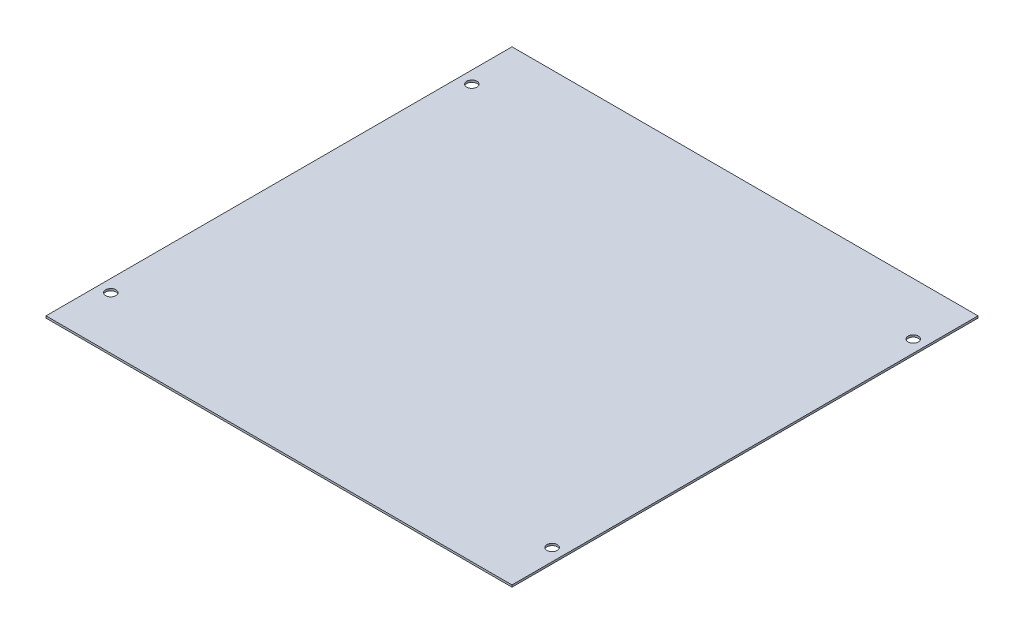
ISO-10303-21;
HEADER;
FILE_DESCRIPTION(('STEP AP214'),'2;1');
FILE_NAME('part.step','',(''),(''),'','','');
FILE_SCHEMA(('AUTOMOTIVE_DESIGN { 1 0 10303 214 1 1 1 1 }'));
ENDSEC;
DATA;
#1=APPLICATION_CONTEXT('core data for automotive mechanical design processes');
#2=APPLICATION_PROTOCOL_DEFINITION('international standard','automotive_design',2000,#1);
#3=PRODUCT_CONTEXT('',#1,'mechanical');
#4=PRODUCT('Part','Part','',(#3));
#5=PRODUCT_RELATED_PRODUCT_CATEGORY('part','',(#4));
#6=PRODUCT_DEFINITION_FORMATION('','',#4);
#7=PRODUCT_DEFINITION_CONTEXT('part definition',#1,'design');
#8=PRODUCT_DEFINITION('design','',#6,#7);
#9=PRODUCT_DEFINITION_SHAPE('','',#8);
#10=(LENGTH_UNIT() NAMED_UNIT(*) SI_UNIT(.MILLI.,.METRE.));
#11=(NAMED_UNIT(*) PLANE_ANGLE_UNIT() SI_UNIT($,.RADIAN.));
#12=(NAMED_UNIT(*) SI_UNIT($,.STERADIAN.) SOLID_ANGLE_UNIT());
#13=UNCERTAINTY_MEASURE_WITH_UNIT(LENGTH_MEASURE(1.E-05),#10,'distance_accuracy_value','');
#14=(GEOMETRIC_REPRESENTATION_CONTEXT(3) GLOBAL_UNCERTAINTY_ASSIGNED_CONTEXT((#13)) GLOBAL_UNIT_ASSIGNED_CONTEXT((#10,
#11,#12)) REPRESENTATION_CONTEXT('',''));
#15=CARTESIAN_POINT('',(0.,0.,0.));
#16=DIRECTION('',(0.,0.,1.));
#17=DIRECTION('',(1.,0.,0.));
#18=AXIS2_PLACEMENT_3D('',#15,#16,#17);
#19=CARTESIAN_POINT('',(-147.5,1.27,147.5));
#20=DIRECTION('',(1.,0.,0.));
#21=DIRECTION('',(0.,0.,-1.));
#22=AXIS2_PLACEMENT_3D('',#19,#20,#21);
#23=PLANE('',#22);
#24=DIRECTION('',(0.,0.,1.));
#25=VECTOR('',#24,1.);
#26=CARTESIAN_POINT('',(-147.5,0.,147.5));
#27=LINE('',#26,#25);
#28=CARTESIAN_POINT('',(-147.5,0.,-147.5));
#29=VERTEX_POINT('',#28);
#30=CARTESIAN_POINT('',(-147.5,0.,147.5));
#31=VERTEX_POINT('',#30);
#32=EDGE_CURVE('E95',#29,#31,#27,.T.);
#33=ORIENTED_EDGE('',*,*,#32,.T.);
#34=DIRECTION('',(0.,-1.,0.));
#35=VECTOR('',#34,1.);
#36=CARTESIAN_POINT('',(-147.5,1.27,147.5));
#37=LINE('',#36,#35);
#38=CARTESIAN_POINT('',(-147.5,1.27,147.5));
#39=VERTEX_POINT('',#38);
#40=EDGE_CURVE('E11',#39,#31,#37,.T.);
#41=ORIENTED_EDGE('',*,*,#40,.F.);
#42=DIRECTION('',(0.,0.,1.));
#43=VECTOR('',#42,1.);
#44=CARTESIAN_POINT('',(-147.5,1.27,147.5));
#45=LINE('',#44,#43);
#46=CARTESIAN_POINT('',(-147.5,1.27,-147.5));
#47=VERTEX_POINT('',#46);
#48=EDGE_CURVE('E83',#47,#39,#45,.T.);
#49=ORIENTED_EDGE('',*,*,#48,.F.);
#50=DIRECTION('',(0.,-1.,0.));
#51=VECTOR('',#50,1.);
#52=CARTESIAN_POINT('',(-147.5,1.27,-147.5));
#53=LINE('',#52,#51);
#54=EDGE_CURVE('E91',#47,#29,#53,.T.);
#55=ORIENTED_EDGE('',*,*,#54,.T.);
#56=EDGE_LOOP('',(#33,#41,#49,#55));
#57=FACE_BOUND('',#56,.T.);
#58=ADVANCED_FACE('F32',(#57),#23,.F.);
#59=CARTESIAN_POINT('',(147.5,1.27,147.5));
#60=DIRECTION('',(0.,0.,-1.));
#61=DIRECTION('',(-1.,0.,0.));
#62=AXIS2_PLACEMENT_3D('',#59,#60,#61);
#63=PLANE('',#62);
#64=DIRECTION('',(1.,0.,0.));
#65=VECTOR('',#64,1.);
#66=CARTESIAN_POINT('',(147.5,0.,147.5));
#67=LINE('',#66,#65);
#68=CARTESIAN_POINT('',(147.5,0.,147.5));
#69=VERTEX_POINT('',#68);
#70=EDGE_CURVE('E87',#31,#69,#67,.T.);
#71=ORIENTED_EDGE('',*,*,#70,.T.);
#72=DIRECTION('',(0.,-1.,0.));
#73=VECTOR('',#72,1.);
#74=CARTESIAN_POINT('',(147.5,1.27,147.5));
#75=LINE('',#74,#73);
#76=CARTESIAN_POINT('',(147.5,1.27,147.5));
#77=VERTEX_POINT('',#76);
#78=EDGE_CURVE('E40',#77,#69,#75,.T.);
#79=ORIENTED_EDGE('',*,*,#78,.F.);
#80=DIRECTION('',(1.,0.,0.));
#81=VECTOR('',#80,1.);
#82=CARTESIAN_POINT('',(147.5,1.27,147.5));
#83=LINE('',#82,#81);
#84=EDGE_CURVE('E78',#39,#77,#83,.T.);
#85=ORIENTED_EDGE('',*,*,#84,.F.);
#86=ORIENTED_EDGE('',*,*,#40,.T.);
#87=EDGE_LOOP('',(#71,#79,#85,#86));
#88=FACE_BOUND('',#87,.T.);
#89=ADVANCED_FACE('F86',(#88),#63,.F.);
#90=CARTESIAN_POINT('',(147.5,1.27,147.5));
#91=DIRECTION('',(-1.,0.,0.));
#92=DIRECTION('',(0.,0.,1.));
#93=AXIS2_PLACEMENT_3D('',#90,#91,#92);
#94=PLANE('',#93);
#95=DIRECTION('',(0.,0.,-1.));
#96=VECTOR('',#95,1.);
#97=CARTESIAN_POINT('',(147.5,0.,147.5));
#98=LINE('',#97,#96);
#99=CARTESIAN_POINT('',(147.5,0.,-147.5));
#100=VERTEX_POINT('',#99);
#101=EDGE_CURVE('E65',#69,#100,#98,.T.);
#102=ORIENTED_EDGE('',*,*,#101,.T.);
#103=DIRECTION('',(0.,-1.,0.));
#104=VECTOR('',#103,1.);
#105=CARTESIAN_POINT('',(147.5,1.27,-147.5));
#106=LINE('',#105,#104);
#107=CARTESIAN_POINT('',(147.5,1.27,-147.5));
#108=VERTEX_POINT('',#107);
#109=EDGE_CURVE('E88',#108,#100,#106,.T.);
#110=ORIENTED_EDGE('',*,*,#109,.F.);
#111=DIRECTION('',(0.,0.,-1.));
#112=VECTOR('',#111,1.);
#113=CARTESIAN_POINT('',(147.5,1.27,147.5));
#114=LINE('',#113,#112);
#115=EDGE_CURVE('E81',#77,#108,#114,.T.);
#116=ORIENTED_EDGE('',*,*,#115,.F.);
#117=ORIENTED_EDGE('',*,*,#78,.T.);
#118=EDGE_LOOP('',(#102,#110,#116,#117));
#119=FACE_BOUND('',#118,.T.);
#120=ADVANCED_FACE('F89',(#119),#94,.F.);
#121=CARTESIAN_POINT('',(147.5,1.27,-147.5));
#122=DIRECTION('',(0.,0.,1.));
#123=DIRECTION('',(1.,0.,0.));
#124=AXIS2_PLACEMENT_3D('',#121,#122,#123);
#125=PLANE('',#124);
#126=DIRECTION('',(-1.,0.,0.));
#127=VECTOR('',#126,1.);
#128=CARTESIAN_POINT('',(147.5,0.,-147.5));
#129=LINE('',#128,#127);
#130=EDGE_CURVE('E71',#100,#29,#129,.T.);
#131=ORIENTED_EDGE('',*,*,#130,.T.);
#132=ORIENTED_EDGE('',*,*,#54,.F.);
#133=DIRECTION('',(-1.,0.,0.));
#134=VECTOR('',#133,1.);
#135=CARTESIAN_POINT('',(147.5,1.27,-147.5));
#136=LINE('',#135,#134);
#137=EDGE_CURVE('E48',#108,#47,#136,.T.);
#138=ORIENTED_EDGE('',*,*,#137,.F.);
#139=ORIENTED_EDGE('',*,*,#109,.T.);
#140=EDGE_LOOP('',(#131,#132,#138,#139));
#141=FACE_BOUND('',#140,.T.);
#142=ADVANCED_FACE('F103',(#141),#125,.F.);
#143=CARTESIAN_POINT('',(0.,1.27,0.));
#144=DIRECTION('',(0.,1.,0.));
#145=DIRECTION('',(0.,0.,1.));
#146=AXIS2_PLACEMENT_3D('',#143,#144,#145);
#147=PLANE('',#146);
#148=CARTESIAN_POINT('',(-139.7,1.27,114.3));
#149=DIRECTION('',(0.,1.,0.));
#150=DIRECTION('',(0.,0.,1.));
#151=AXIS2_PLACEMENT_3D('',#148,#149,#150);
#152=CIRCLE('',#151,3.25000000000001);
#153=CARTESIAN_POINT('',(-139.7,1.27,117.55));
#154=VERTEX_POINT('',#153);
#155=EDGE_CURVE('E115',#154,#154,#152,.T.);
#156=ORIENTED_EDGE('',*,*,#155,.F.);
#157=EDGE_LOOP('',(#156));
#158=FACE_BOUND('',#157,.T.);
#159=CARTESIAN_POINT('',(139.7,1.27,114.3));
#160=DIRECTION('',(0.,1.,0.));
#161=DIRECTION('',(0.,0.,1.));
#162=AXIS2_PLACEMENT_3D('',#159,#160,#161);
#163=CIRCLE('',#162,3.25000000000001);
#164=CARTESIAN_POINT('',(139.7,1.27,117.55));
#165=VERTEX_POINT('',#164);
#166=EDGE_CURVE('E121',#165,#165,#163,.T.);
#167=ORIENTED_EDGE('',*,*,#166,.F.);
#168=EDGE_LOOP('',(#167));
#169=FACE_BOUND('',#168,.T.);
#170=CARTESIAN_POINT('',(139.7,1.27,-114.3));
#171=DIRECTION('',(0.,1.,0.));
#172=DIRECTION('',(0.,0.,1.));
#173=AXIS2_PLACEMENT_3D('',#170,#171,#172);
#174=CIRCLE('',#173,3.25000000000001);
#175=CARTESIAN_POINT('',(139.7,1.27,-111.05));
#176=VERTEX_POINT('',#175);
#177=EDGE_CURVE('E127',#176,#176,#174,.T.);
#178=ORIENTED_EDGE('',*,*,#177,.F.);
#179=EDGE_LOOP('',(#178));
#180=FACE_BOUND('',#179,.T.);
#181=CARTESIAN_POINT('',(-139.7,1.27,-114.3));
#182=DIRECTION('',(0.,1.,0.));
#183=DIRECTION('',(0.,0.,1.));
#184=AXIS2_PLACEMENT_3D('',#181,#182,#183);
#185=CIRCLE('',#184,3.25000000000001);
#186=CARTESIAN_POINT('',(-139.7,1.27,-111.05));
#187=VERTEX_POINT('',#186);
#188=EDGE_CURVE('E109',#187,#187,#185,.T.);
#189=ORIENTED_EDGE('',*,*,#188,.F.);
#190=EDGE_LOOP('',(#189));
#191=FACE_BOUND('',#190,.T.);
#192=ORIENTED_EDGE('',*,*,#48,.T.);
#193=ORIENTED_EDGE('',*,*,#84,.T.);
#194=ORIENTED_EDGE('',*,*,#115,.T.);
#195=ORIENTED_EDGE('',*,*,#137,.T.);
#196=EDGE_LOOP('',(#192,#193,#194,#195));
#197=FACE_BOUND('',#196,.T.);
#198=ADVANCED_FACE('F79',(#158,#169,#180,#191,#197),#147,.T.);
#199=CARTESIAN_POINT('',(0.,0.,0.));
#200=DIRECTION('',(0.,1.,0.));
#201=DIRECTION('',(0.,0.,1.));
#202=AXIS2_PLACEMENT_3D('',#199,#200,#201);
#203=PLANE('',#202);
#204=CARTESIAN_POINT('',(-139.7,0.,114.3));
#205=DIRECTION('',(0.,1.,0.));
#206=DIRECTION('',(0.,0.,1.));
#207=AXIS2_PLACEMENT_3D('',#204,#205,#206);
#208=CIRCLE('',#207,3.25000000000001);
#209=CARTESIAN_POINT('',(-139.7,0.,117.55));
#210=VERTEX_POINT('',#209);
#211=EDGE_CURVE('E118',#210,#210,#208,.T.);
#212=ORIENTED_EDGE('',*,*,#211,.T.);
#213=EDGE_LOOP('',(#212));
#214=FACE_BOUND('',#213,.T.);
#215=CARTESIAN_POINT('',(139.7,0.,114.3));
#216=DIRECTION('',(0.,1.,0.));
#217=DIRECTION('',(0.,0.,1.));
#218=AXIS2_PLACEMENT_3D('',#215,#216,#217);
#219=CIRCLE('',#218,3.25000000000001);
#220=CARTESIAN_POINT('',(139.7,0.,117.55));
#221=VERTEX_POINT('',#220);
#222=EDGE_CURVE('E124',#221,#221,#219,.T.);
#223=ORIENTED_EDGE('',*,*,#222,.T.);
#224=EDGE_LOOP('',(#223));
#225=FACE_BOUND('',#224,.T.);
#226=CARTESIAN_POINT('',(139.7,0.,-114.3));
#227=DIRECTION('',(0.,1.,0.));
#228=DIRECTION('',(0.,0.,1.));
#229=AXIS2_PLACEMENT_3D('',#226,#227,#228);
#230=CIRCLE('',#229,3.25000000000001);
#231=CARTESIAN_POINT('',(139.7,0.,-111.05));
#232=VERTEX_POINT('',#231);
#233=EDGE_CURVE('E112',#232,#232,#230,.T.);
#234=ORIENTED_EDGE('',*,*,#233,.T.);
#235=EDGE_LOOP('',(#234));
#236=FACE_BOUND('',#235,.T.);
#237=CARTESIAN_POINT('',(-139.7,0.,-114.3));
#238=DIRECTION('',(0.,1.,0.));
#239=DIRECTION('',(0.,0.,1.));
#240=AXIS2_PLACEMENT_3D('',#237,#238,#239);
#241=CIRCLE('',#240,3.25000000000001);
#242=CARTESIAN_POINT('',(-139.7,0.,-111.05));
#243=VERTEX_POINT('',#242);
#244=EDGE_CURVE('E98',#243,#243,#241,.T.);
#245=ORIENTED_EDGE('',*,*,#244,.T.);
#246=EDGE_LOOP('',(#245));
#247=FACE_BOUND('',#246,.T.);
#248=ORIENTED_EDGE('',*,*,#32,.F.);
#249=ORIENTED_EDGE('',*,*,#130,.F.);
#250=ORIENTED_EDGE('',*,*,#101,.F.);
#251=ORIENTED_EDGE('',*,*,#70,.F.);
#252=EDGE_LOOP('',(#248,#249,#250,#251));
#253=FACE_BOUND('',#252,.T.);
#254=ADVANCED_FACE('F106',(#214,#225,#236,#247,#253),#203,.F.);
#255=CARTESIAN_POINT('',(-139.7,0.,-114.3));
#256=DIRECTION('',(0.,1.,0.));
#257=DIRECTION('',(0.,0.,1.));
#258=AXIS2_PLACEMENT_3D('',#255,#256,#257);
#259=CYLINDRICAL_SURFACE('',#258,3.25000000000001);
#260=ORIENTED_EDGE('',*,*,#244,.F.);
#261=EDGE_LOOP('',(#260));
#262=FACE_BOUND('',#261,.T.);
#263=ORIENTED_EDGE('',*,*,#188,.T.);
#264=EDGE_LOOP('',(#263));
#265=FACE_BOUND('',#264,.T.);
#266=ADVANCED_FACE('F139',(#262,#265),#259,.F.);
#267=CARTESIAN_POINT('',(139.7,0.,-114.3));
#268=DIRECTION('',(0.,1.,0.));
#269=DIRECTION('',(0.,0.,1.));
#270=AXIS2_PLACEMENT_3D('',#267,#268,#269);
#271=CYLINDRICAL_SURFACE('',#270,3.25000000000001);
#272=ORIENTED_EDGE('',*,*,#233,.F.);
#273=EDGE_LOOP('',(#272));
#274=FACE_BOUND('',#273,.T.);
#275=ORIENTED_EDGE('',*,*,#177,.T.);
#276=EDGE_LOOP('',(#275));
#277=FACE_BOUND('',#276,.T.);
#278=ADVANCED_FACE('F135',(#274,#277),#271,.F.);
#279=CARTESIAN_POINT('',(139.7,0.,114.3));
#280=DIRECTION('',(0.,1.,0.));
#281=DIRECTION('',(0.,0.,1.));
#282=AXIS2_PLACEMENT_3D('',#279,#280,#281);
#283=CYLINDRICAL_SURFACE('',#282,3.25000000000001);
#284=ORIENTED_EDGE('',*,*,#222,.F.);
#285=EDGE_LOOP('',(#284));
#286=FACE_BOUND('',#285,.T.);
#287=ORIENTED_EDGE('',*,*,#166,.T.);
#288=EDGE_LOOP('',(#287));
#289=FACE_BOUND('',#288,.T.);
#290=ADVANCED_FACE('F138',(#286,#289),#283,.F.);
#291=CARTESIAN_POINT('',(-139.7,0.,114.3));
#292=DIRECTION('',(0.,1.,0.));
#293=DIRECTION('',(0.,0.,1.));
#294=AXIS2_PLACEMENT_3D('',#291,#292,#293);
#295=CYLINDRICAL_SURFACE('',#294,3.25000000000001);
#296=ORIENTED_EDGE('',*,*,#211,.F.);
#297=EDGE_LOOP('',(#296));
#298=FACE_BOUND('',#297,.T.);
#299=ORIENTED_EDGE('',*,*,#155,.T.);
#300=EDGE_LOOP('',(#299));
#301=FACE_BOUND('',#300,.T.);
#302=ADVANCED_FACE('F200',(#298,#301),#295,.F.);
#303=CLOSED_SHELL('',(#58,#89,#120,#142,#198,#254,#266,#278,#290,#302));
#304=MANIFOLD_SOLID_BREP('B2',#303);
#305=ADVANCED_BREP_SHAPE_REPRESENTATION('',(#18,#304),#14);
#306=SHAPE_DEFINITION_REPRESENTATION(#9,#305);
ENDSEC;
END-ISO-10303-21;
